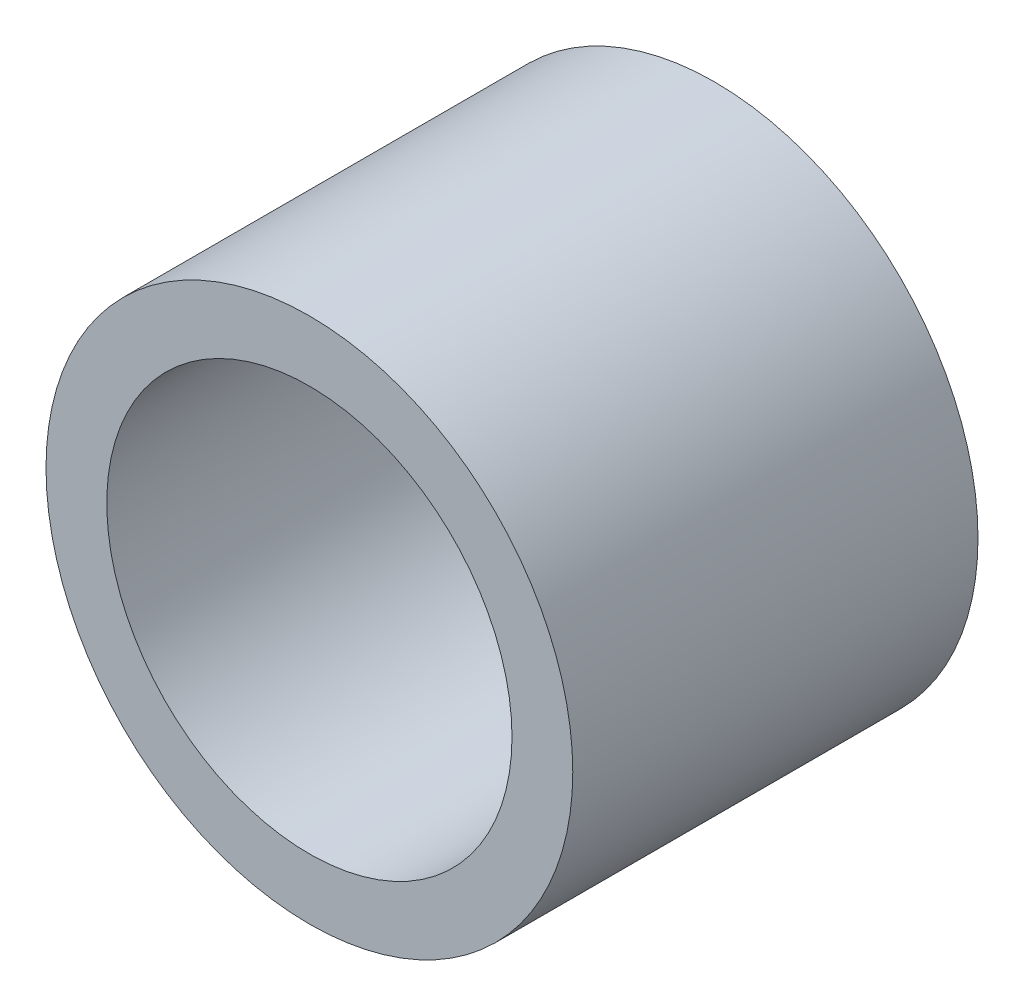
ISO-10303-21;
HEADER;
FILE_DESCRIPTION(('STEP AP214'),'2;1');
FILE_NAME('part.step','',(''),(''),'','','');
FILE_SCHEMA(('AUTOMOTIVE_DESIGN { 1 0 10303 214 1 1 1 1 }'));
ENDSEC;
DATA;
#1=APPLICATION_CONTEXT('core data for automotive mechanical design processes');
#2=APPLICATION_PROTOCOL_DEFINITION('international standard','automotive_design',2000,#1);
#3=PRODUCT_CONTEXT('',#1,'mechanical');
#4=PRODUCT('Part','Part','',(#3));
#5=PRODUCT_RELATED_PRODUCT_CATEGORY('part','',(#4));
#6=PRODUCT_DEFINITION_FORMATION('','',#4);
#7=PRODUCT_DEFINITION_CONTEXT('part definition',#1,'design');
#8=PRODUCT_DEFINITION('design','',#6,#7);
#9=PRODUCT_DEFINITION_SHAPE('','',#8);
#10=(LENGTH_UNIT() NAMED_UNIT(*) SI_UNIT(.MILLI.,.METRE.));
#11=(NAMED_UNIT(*) PLANE_ANGLE_UNIT() SI_UNIT($,.RADIAN.));
#12=(NAMED_UNIT(*) SI_UNIT($,.STERADIAN.) SOLID_ANGLE_UNIT());
#13=UNCERTAINTY_MEASURE_WITH_UNIT(LENGTH_MEASURE(1.E-05),#10,'distance_accuracy_value','');
#14=(GEOMETRIC_REPRESENTATION_CONTEXT(3) GLOBAL_UNCERTAINTY_ASSIGNED_CONTEXT((#13)) GLOBAL_UNIT_ASSIGNED_CONTEXT((#10,
#11,#12)) REPRESENTATION_CONTEXT('',''));
#15=CARTESIAN_POINT('',(0.,0.,0.));
#16=DIRECTION('',(0.,0.,1.));
#17=DIRECTION('',(1.,0.,0.));
#18=AXIS2_PLACEMENT_3D('',#15,#16,#17);
#19=CARTESIAN_POINT('',(0.,0.,10.));
#20=DIRECTION('',(0.,0.,1.));
#21=DIRECTION('',(1.,0.,0.));
#22=AXIS2_PLACEMENT_3D('',#19,#20,#21);
#23=PLANE('',#22);
#24=CARTESIAN_POINT('',(0.,0.,10.));
#25=DIRECTION('',(0.,0.,1.));
#26=DIRECTION('',(1.,0.,0.));
#27=AXIS2_PLACEMENT_3D('',#24,#25,#26);
#28=CIRCLE('',#27,13.);
#29=CARTESIAN_POINT('',(13.,0.,10.));
#30=VERTEX_POINT('',#29);
#31=EDGE_CURVE('E10',#30,#30,#28,.T.);
#32=ORIENTED_EDGE('',*,*,#31,.T.);
#33=EDGE_LOOP('',(#32));
#34=FACE_BOUND('',#33,.T.);
#35=CARTESIAN_POINT('',(0.,0.,10.));
#36=DIRECTION('',(0.,0.,1.));
#37=DIRECTION('',(1.,0.,0.));
#38=AXIS2_PLACEMENT_3D('',#35,#36,#37);
#39=CIRCLE('',#38,10.);
#40=CARTESIAN_POINT('',(10.,0.,10.));
#41=VERTEX_POINT('',#40);
#42=EDGE_CURVE('E44',#41,#41,#39,.T.);
#43=ORIENTED_EDGE('',*,*,#42,.F.);
#44=EDGE_LOOP('',(#43));
#45=FACE_BOUND('',#44,.T.);
#46=ADVANCED_FACE('F33',(#34,#45),#23,.T.);
#47=CARTESIAN_POINT('',(0.,0.,-10.));
#48=DIRECTION('',(0.,0.,1.));
#49=DIRECTION('',(1.,0.,0.));
#50=AXIS2_PLACEMENT_3D('',#47,#48,#49);
#51=PLANE('',#50);
#52=CARTESIAN_POINT('',(0.,0.,-10.));
#53=DIRECTION('',(0.,0.,1.));
#54=DIRECTION('',(1.,0.,0.));
#55=AXIS2_PLACEMENT_3D('',#52,#53,#54);
#56=CIRCLE('',#55,13.);
#57=CARTESIAN_POINT('',(13.,0.,-10.));
#58=VERTEX_POINT('',#57);
#59=EDGE_CURVE('E37',#58,#58,#56,.T.);
#60=ORIENTED_EDGE('',*,*,#59,.F.);
#61=EDGE_LOOP('',(#60));
#62=FACE_BOUND('',#61,.T.);
#63=CARTESIAN_POINT('',(0.,0.,-10.));
#64=DIRECTION('',(0.,0.,1.));
#65=DIRECTION('',(1.,0.,0.));
#66=AXIS2_PLACEMENT_3D('',#63,#64,#65);
#67=CIRCLE('',#66,10.);
#68=CARTESIAN_POINT('',(10.,0.,-10.));
#69=VERTEX_POINT('',#68);
#70=EDGE_CURVE('E46',#69,#69,#67,.T.);
#71=ORIENTED_EDGE('',*,*,#70,.T.);
#72=EDGE_LOOP('',(#71));
#73=FACE_BOUND('',#72,.T.);
#74=ADVANCED_FACE('F56',(#62,#73),#51,.F.);
#75=CARTESIAN_POINT('',(0.,0.,10.));
#76=DIRECTION('',(0.,0.,-1.));
#77=DIRECTION('',(-1.,0.,0.));
#78=AXIS2_PLACEMENT_3D('',#75,#76,#77);
#79=CYLINDRICAL_SURFACE('',#78,13.);
#80=ORIENTED_EDGE('',*,*,#31,.F.);
#81=EDGE_LOOP('',(#80));
#82=FACE_BOUND('',#81,.T.);
#83=ORIENTED_EDGE('',*,*,#59,.T.);
#84=EDGE_LOOP('',(#83));
#85=FACE_BOUND('',#84,.T.);
#86=ADVANCED_FACE('F35',(#82,#85),#79,.T.);
#87=CARTESIAN_POINT('',(0.,0.,10.));
#88=DIRECTION('',(0.,0.,-1.));
#89=DIRECTION('',(-1.,0.,0.));
#90=AXIS2_PLACEMENT_3D('',#87,#88,#89);
#91=CYLINDRICAL_SURFACE('',#90,10.);
#92=ORIENTED_EDGE('',*,*,#42,.T.);
#93=EDGE_LOOP('',(#92));
#94=FACE_BOUND('',#93,.T.);
#95=ORIENTED_EDGE('',*,*,#70,.F.);
#96=EDGE_LOOP('',(#95));
#97=FACE_BOUND('',#96,.T.);
#98=ADVANCED_FACE('F52',(#94,#97),#91,.F.);
#99=CLOSED_SHELL('',(#46,#74,#86,#98));
#100=MANIFOLD_SOLID_BREP('B2',#99);
#101=ADVANCED_BREP_SHAPE_REPRESENTATION('',(#18,#100),#14);
#102=SHAPE_DEFINITION_REPRESENTATION(#9,#101);
ENDSEC;
END-ISO-10303-21;
